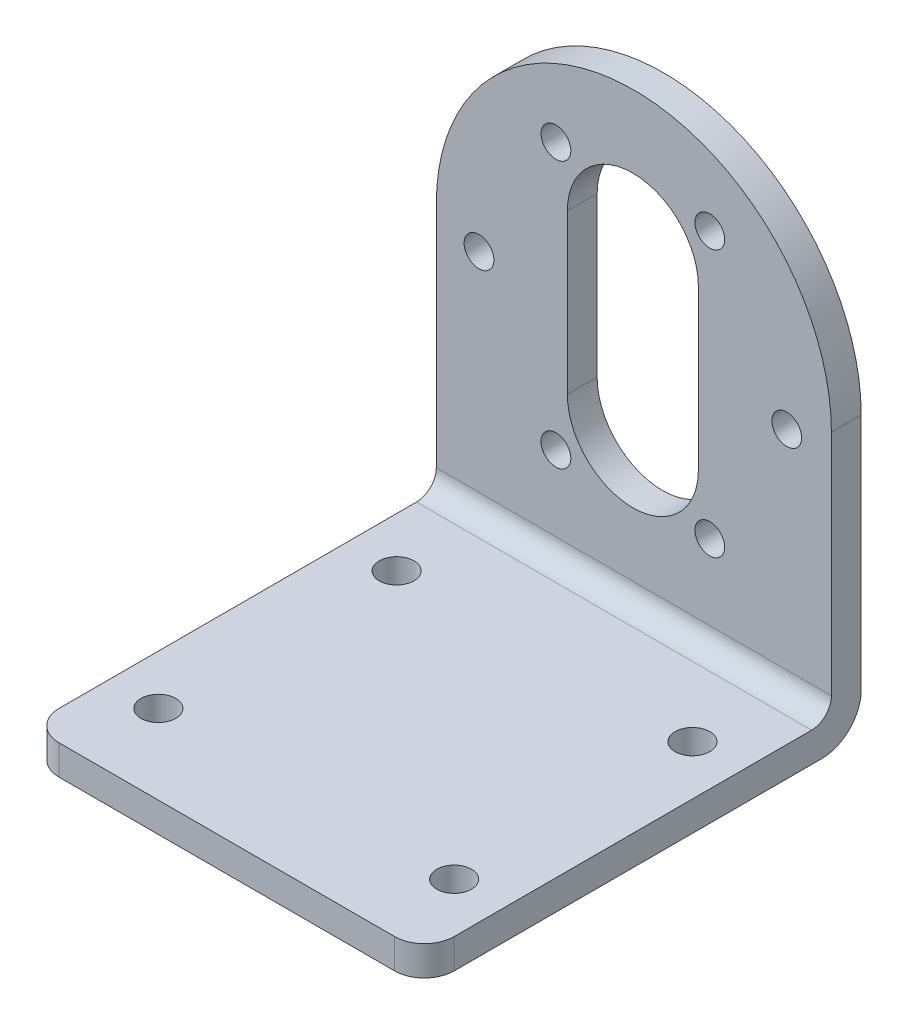
ISO-10303-21;
HEADER;
FILE_DESCRIPTION(('STEP AP214'),'2;1');
FILE_NAME('part.step','',(''),(''),'','','');
FILE_SCHEMA(('AUTOMOTIVE_DESIGN { 1 0 10303 214 1 1 1 1 }'));
ENDSEC;
DATA;
#1=APPLICATION_CONTEXT('core data for automotive mechanical design processes');
#2=APPLICATION_PROTOCOL_DEFINITION('international standard','automotive_design',2000,#1);
#3=PRODUCT_CONTEXT('',#1,'mechanical');
#4=PRODUCT('Part','Part','',(#3));
#5=PRODUCT_RELATED_PRODUCT_CATEGORY('part','',(#4));
#6=PRODUCT_DEFINITION_FORMATION('','',#4);
#7=PRODUCT_DEFINITION_CONTEXT('part definition',#1,'design');
#8=PRODUCT_DEFINITION('design','',#6,#7);
#9=PRODUCT_DEFINITION_SHAPE('','',#8);
#10=(LENGTH_UNIT() NAMED_UNIT(*) SI_UNIT(.MILLI.,.METRE.));
#11=(NAMED_UNIT(*) PLANE_ANGLE_UNIT() SI_UNIT($,.RADIAN.));
#12=(NAMED_UNIT(*) SI_UNIT($,.STERADIAN.) SOLID_ANGLE_UNIT());
#13=UNCERTAINTY_MEASURE_WITH_UNIT(LENGTH_MEASURE(1.E-05),#10,'distance_accuracy_value','');
#14=(GEOMETRIC_REPRESENTATION_CONTEXT(3) GLOBAL_UNCERTAINTY_ASSIGNED_CONTEXT((#13)) GLOBAL_UNIT_ASSIGNED_CONTEXT((#10,
#11,#12)) REPRESENTATION_CONTEXT('',''));
#15=CARTESIAN_POINT('',(0.,0.,0.));
#16=DIRECTION('',(0.,0.,1.));
#17=DIRECTION('',(1.,0.,0.));
#18=AXIS2_PLACEMENT_3D('',#15,#16,#17);
#19=CARTESIAN_POINT('',(-35.5,26.,-41.));
#20=DIRECTION('',(0.,0.,-1.));
#21=DIRECTION('',(-1.,0.,0.));
#22=AXIS2_PLACEMENT_3D('',#19,#20,#21);
#23=CYLINDRICAL_SURFACE('',#22,1.5);
#24=CARTESIAN_POINT('',(-35.5,26.,-44.));
#25=DIRECTION('',(0.,0.,-1.));
#26=DIRECTION('',(-1.,0.,0.));
#27=AXIS2_PLACEMENT_3D('',#24,#25,#26);
#28=CIRCLE('',#27,1.5);
#29=CARTESIAN_POINT('',(-37.,26.,-44.));
#30=VERTEX_POINT('',#29);
#31=EDGE_CURVE('E20',#30,#30,#28,.F.);
#32=ORIENTED_EDGE('',*,*,#31,.F.);
#33=EDGE_LOOP('',(#32));
#34=FACE_BOUND('',#33,.T.);
#35=CARTESIAN_POINT('',(-35.5,26.,-41.));
#36=DIRECTION('',(0.,0.,-1.));
#37=DIRECTION('',(-1.,0.,0.));
#38=AXIS2_PLACEMENT_3D('',#35,#36,#37);
#39=CIRCLE('',#38,1.5);
#40=CARTESIAN_POINT('',(-37.,26.,-41.));
#41=VERTEX_POINT('',#40);
#42=EDGE_CURVE('E286',#41,#41,#39,.F.);
#43=ORIENTED_EDGE('',*,*,#42,.T.);
#44=EDGE_LOOP('',(#43));
#45=FACE_BOUND('',#44,.T.);
#46=ADVANCED_FACE('F17',(#34,#45),#23,.F.);
#47=CARTESIAN_POINT('',(-12.25,39.4233937586588,-41.));
#48=DIRECTION('',(0.,0.,-1.));
#49=DIRECTION('',(-1.,0.,0.));
#50=AXIS2_PLACEMENT_3D('',#47,#48,#49);
#51=CYLINDRICAL_SURFACE('',#50,1.5);
#52=CARTESIAN_POINT('',(-12.25,39.4233937586588,-44.));
#53=DIRECTION('',(0.,0.,-1.));
#54=DIRECTION('',(-1.,0.,0.));
#55=AXIS2_PLACEMENT_3D('',#52,#53,#54);
#56=CIRCLE('',#55,1.5);
#57=CARTESIAN_POINT('',(-13.75,39.4233937586588,-44.));
#58=VERTEX_POINT('',#57);
#59=EDGE_CURVE('E169',#58,#58,#56,.F.);
#60=ORIENTED_EDGE('',*,*,#59,.F.);
#61=EDGE_LOOP('',(#60));
#62=FACE_BOUND('',#61,.T.);
#63=CARTESIAN_POINT('',(-12.25,39.4233937586588,-41.));
#64=DIRECTION('',(0.,0.,-1.));
#65=DIRECTION('',(-1.,0.,0.));
#66=AXIS2_PLACEMENT_3D('',#63,#64,#65);
#67=CIRCLE('',#66,1.5);
#68=CARTESIAN_POINT('',(-13.75,39.4233937586588,-41.));
#69=VERTEX_POINT('',#68);
#70=EDGE_CURVE('E282',#69,#69,#67,.F.);
#71=ORIENTED_EDGE('',*,*,#70,.T.);
#72=EDGE_LOOP('',(#71));
#73=FACE_BOUND('',#72,.T.);
#74=ADVANCED_FACE('F568',(#62,#73),#51,.F.);
#75=CARTESIAN_POINT('',(-27.75,12.5766062413412,-41.));
#76=DIRECTION('',(0.,0.,-1.));
#77=DIRECTION('',(-1.,0.,0.));
#78=AXIS2_PLACEMENT_3D('',#75,#76,#77);
#79=CYLINDRICAL_SURFACE('',#78,1.5);
#80=CARTESIAN_POINT('',(-27.75,12.5766062413412,-44.));
#81=DIRECTION('',(0.,0.,-1.));
#82=DIRECTION('',(-1.,0.,0.));
#83=AXIS2_PLACEMENT_3D('',#80,#81,#82);
#84=CIRCLE('',#83,1.5);
#85=CARTESIAN_POINT('',(-29.25,12.5766062413412,-44.));
#86=VERTEX_POINT('',#85);
#87=EDGE_CURVE('E166',#86,#86,#84,.F.);
#88=ORIENTED_EDGE('',*,*,#87,.F.);
#89=EDGE_LOOP('',(#88));
#90=FACE_BOUND('',#89,.T.);
#91=CARTESIAN_POINT('',(-27.75,12.5766062413412,-41.));
#92=DIRECTION('',(0.,0.,-1.));
#93=DIRECTION('',(-1.,0.,0.));
#94=AXIS2_PLACEMENT_3D('',#91,#92,#93);
#95=CIRCLE('',#94,1.5);
#96=CARTESIAN_POINT('',(-29.25,12.5766062413412,-41.));
#97=VERTEX_POINT('',#96);
#98=EDGE_CURVE('E278',#97,#97,#95,.F.);
#99=ORIENTED_EDGE('',*,*,#98,.T.);
#100=EDGE_LOOP('',(#99));
#101=FACE_BOUND('',#100,.T.);
#102=ADVANCED_FACE('F559',(#90,#101),#79,.F.);
#103=CARTESIAN_POINT('',(-27.75,39.4233937586588,-41.));
#104=DIRECTION('',(0.,0.,-1.));
#105=DIRECTION('',(-1.,0.,0.));
#106=AXIS2_PLACEMENT_3D('',#103,#104,#105);
#107=CYLINDRICAL_SURFACE('',#106,1.5);
#108=CARTESIAN_POINT('',(-27.75,39.4233937586588,-44.));
#109=DIRECTION('',(0.,0.,-1.));
#110=DIRECTION('',(-1.,0.,0.));
#111=AXIS2_PLACEMENT_3D('',#108,#109,#110);
#112=CIRCLE('',#111,1.5);
#113=CARTESIAN_POINT('',(-29.25,39.4233937586588,-44.));
#114=VERTEX_POINT('',#113);
#115=EDGE_CURVE('E162',#114,#114,#112,.F.);
#116=ORIENTED_EDGE('',*,*,#115,.F.);
#117=EDGE_LOOP('',(#116));
#118=FACE_BOUND('',#117,.T.);
#119=CARTESIAN_POINT('',(-27.75,39.4233937586588,-41.));
#120=DIRECTION('',(0.,0.,-1.));
#121=DIRECTION('',(-1.,0.,0.));
#122=AXIS2_PLACEMENT_3D('',#119,#120,#121);
#123=CIRCLE('',#122,1.5);
#124=CARTESIAN_POINT('',(-29.25,39.4233937586588,-41.));
#125=VERTEX_POINT('',#124);
#126=EDGE_CURVE('E274',#125,#125,#123,.F.);
#127=ORIENTED_EDGE('',*,*,#126,.T.);
#128=EDGE_LOOP('',(#127));
#129=FACE_BOUND('',#128,.T.);
#130=ADVANCED_FACE('F550',(#118,#129),#107,.F.);
#131=CARTESIAN_POINT('',(-4.5,26.,-41.));
#132=DIRECTION('',(0.,0.,-1.));
#133=DIRECTION('',(-1.,0.,0.));
#134=AXIS2_PLACEMENT_3D('',#131,#132,#133);
#135=CYLINDRICAL_SURFACE('',#134,1.5);
#136=CARTESIAN_POINT('',(-4.5,26.,-44.));
#137=DIRECTION('',(0.,0.,-1.));
#138=DIRECTION('',(-1.,0.,0.));
#139=AXIS2_PLACEMENT_3D('',#136,#137,#138);
#140=CIRCLE('',#139,1.5);
#141=CARTESIAN_POINT('',(-6.,26.,-44.));
#142=VERTEX_POINT('',#141);
#143=EDGE_CURVE('E154',#142,#142,#140,.F.);
#144=ORIENTED_EDGE('',*,*,#143,.F.);
#145=EDGE_LOOP('',(#144));
#146=FACE_BOUND('',#145,.T.);
#147=CARTESIAN_POINT('',(-4.5,26.,-41.));
#148=DIRECTION('',(0.,0.,-1.));
#149=DIRECTION('',(-1.,0.,0.));
#150=AXIS2_PLACEMENT_3D('',#147,#148,#149);
#151=CIRCLE('',#150,1.5);
#152=CARTESIAN_POINT('',(-6.,26.,-41.));
#153=VERTEX_POINT('',#152);
#154=EDGE_CURVE('E270',#153,#153,#151,.F.);
#155=ORIENTED_EDGE('',*,*,#154,.T.);
#156=EDGE_LOOP('',(#155));
#157=FACE_BOUND('',#156,.T.);
#158=ADVANCED_FACE('F541',(#146,#157),#135,.F.);
#159=CARTESIAN_POINT('',(-12.25,12.5766062413412,-41.));
#160=DIRECTION('',(0.,0.,-1.));
#161=DIRECTION('',(-1.,0.,0.));
#162=AXIS2_PLACEMENT_3D('',#159,#160,#161);
#163=CYLINDRICAL_SURFACE('',#162,1.5);
#164=CARTESIAN_POINT('',(-12.25,12.5766062413412,-44.));
#165=DIRECTION('',(0.,0.,-1.));
#166=DIRECTION('',(-1.,0.,0.));
#167=AXIS2_PLACEMENT_3D('',#164,#165,#166);
#168=CIRCLE('',#167,1.5);
#169=CARTESIAN_POINT('',(-13.75,12.5766062413412,-44.));
#170=VERTEX_POINT('',#169);
#171=EDGE_CURVE('E149',#170,#170,#168,.F.);
#172=ORIENTED_EDGE('',*,*,#171,.F.);
#173=EDGE_LOOP('',(#172));
#174=FACE_BOUND('',#173,.T.);
#175=CARTESIAN_POINT('',(-12.25,12.5766062413412,-41.));
#176=DIRECTION('',(0.,0.,-1.));
#177=DIRECTION('',(-1.,0.,0.));
#178=AXIS2_PLACEMENT_3D('',#175,#176,#177);
#179=CIRCLE('',#178,1.5);
#180=CARTESIAN_POINT('',(-13.75,12.5766062413412,-41.));
#181=VERTEX_POINT('',#180);
#182=EDGE_CURVE('E266',#181,#181,#179,.F.);
#183=ORIENTED_EDGE('',*,*,#182,.T.);
#184=EDGE_LOOP('',(#183));
#185=FACE_BOUND('',#184,.T.);
#186=ADVANCED_FACE('F533',(#174,#185),#163,.F.);
#187=CARTESIAN_POINT('',(-26.6,18.,-41.));
#188=DIRECTION('',(-1.,0.,0.));
#189=DIRECTION('',(0.,-1.,0.));
#190=AXIS2_PLACEMENT_3D('',#187,#188,#189);
#191=PLANE('',#190);
#192=DIRECTION('',(0.,0.,-1.));
#193=VECTOR('',#192,1.);
#194=CARTESIAN_POINT('',(-26.6,34.,-41.));
#195=LINE('',#194,#193);
#196=CARTESIAN_POINT('',(-26.6,34.,-44.));
#197=VERTEX_POINT('',#196);
#198=CARTESIAN_POINT('',(-26.6,34.,-41.));
#199=VERTEX_POINT('',#198);
#200=EDGE_CURVE('E121',#197,#199,#195,.F.);
#201=ORIENTED_EDGE('',*,*,#200,.T.);
#202=DIRECTION('',(0.,1.,0.));
#203=VECTOR('',#202,1.);
#204=CARTESIAN_POINT('',(-26.6,25.45,-41.));
#205=LINE('',#204,#203);
#206=CARTESIAN_POINT('',(-26.6,18.,-41.));
#207=VERTEX_POINT('',#206);
#208=EDGE_CURVE('E265',#199,#207,#205,.F.);
#209=ORIENTED_EDGE('',*,*,#208,.T.);
#210=DIRECTION('',(0.,0.,-1.));
#211=VECTOR('',#210,1.);
#212=CARTESIAN_POINT('',(-26.6,18.,-41.));
#213=LINE('',#212,#211);
#214=CARTESIAN_POINT('',(-26.6,18.,-44.));
#215=VERTEX_POINT('',#214);
#216=EDGE_CURVE('E138',#207,#215,#213,.T.);
#217=ORIENTED_EDGE('',*,*,#216,.T.);
#218=DIRECTION('',(0.,1.,0.));
#219=VECTOR('',#218,1.);
#220=CARTESIAN_POINT('',(-26.6,25.45,-44.));
#221=LINE('',#220,#219);
#222=EDGE_CURVE('E135',#197,#215,#221,.F.);
#223=ORIENTED_EDGE('',*,*,#222,.F.);
#224=EDGE_LOOP('',(#201,#209,#217,#223));
#225=FACE_BOUND('',#224,.T.);
#226=ADVANCED_FACE('F136',(#225),#191,.F.);
#227=CARTESIAN_POINT('',(-20.,18.,-41.));
#228=DIRECTION('',(0.,0.,-1.));
#229=DIRECTION('',(-1.,0.,0.));
#230=AXIS2_PLACEMENT_3D('',#227,#228,#229);
#231=CYLINDRICAL_SURFACE('',#230,6.6);
#232=ORIENTED_EDGE('',*,*,#216,.F.);
#233=CARTESIAN_POINT('',(-20.,18.,-41.));
#234=DIRECTION('',(0.,0.,-1.));
#235=DIRECTION('',(-1.,0.,0.));
#236=AXIS2_PLACEMENT_3D('',#233,#234,#235);
#237=CIRCLE('',#236,6.6);
#238=CARTESIAN_POINT('',(-13.4,18.,-41.));
#239=VERTEX_POINT('',#238);
#240=EDGE_CURVE('E262',#207,#239,#237,.F.);
#241=ORIENTED_EDGE('',*,*,#240,.T.);
#242=DIRECTION('',(0.,0.,1.));
#243=VECTOR('',#242,1.);
#244=CARTESIAN_POINT('',(-13.4,18.,-41.));
#245=LINE('',#244,#243);
#246=CARTESIAN_POINT('',(-13.4,18.,-44.));
#247=VERTEX_POINT('',#246);
#248=EDGE_CURVE('E132',#239,#247,#245,.F.);
#249=ORIENTED_EDGE('',*,*,#248,.T.);
#250=CARTESIAN_POINT('',(-20.,18.,-44.));
#251=DIRECTION('',(0.,0.,-1.));
#252=DIRECTION('',(-1.,0.,0.));
#253=AXIS2_PLACEMENT_3D('',#250,#251,#252);
#254=CIRCLE('',#253,6.6);
#255=EDGE_CURVE('E143',#215,#247,#254,.F.);
#256=ORIENTED_EDGE('',*,*,#255,.F.);
#257=EDGE_LOOP('',(#232,#241,#249,#256));
#258=FACE_BOUND('',#257,.T.);
#259=ADVANCED_FACE('F336',(#258),#231,.F.);
#260=CARTESIAN_POINT('',(-13.4,34.,-41.));
#261=DIRECTION('',(1.,0.,0.));
#262=DIRECTION('',(0.,1.,0.));
#263=AXIS2_PLACEMENT_3D('',#260,#261,#262);
#264=PLANE('',#263);
#265=ORIENTED_EDGE('',*,*,#248,.F.);
#266=DIRECTION('',(0.,1.,0.));
#267=VECTOR('',#266,1.);
#268=CARTESIAN_POINT('',(-13.4,25.45,-41.));
#269=LINE('',#268,#267);
#270=CARTESIAN_POINT('',(-13.4,34.,-41.));
#271=VERTEX_POINT('',#270);
#272=EDGE_CURVE('E261',#239,#271,#269,.T.);
#273=ORIENTED_EDGE('',*,*,#272,.T.);
#274=DIRECTION('',(0.,0.,-1.));
#275=VECTOR('',#274,1.);
#276=CARTESIAN_POINT('',(-13.4,34.,-41.));
#277=LINE('',#276,#275);
#278=CARTESIAN_POINT('',(-13.4,34.,-44.));
#279=VERTEX_POINT('',#278);
#280=EDGE_CURVE('E116',#271,#279,#277,.T.);
#281=ORIENTED_EDGE('',*,*,#280,.T.);
#282=DIRECTION('',(0.,1.,0.));
#283=VECTOR('',#282,1.);
#284=CARTESIAN_POINT('',(-13.4,25.45,-44.));
#285=LINE('',#284,#283);
#286=EDGE_CURVE('E147',#247,#279,#285,.T.);
#287=ORIENTED_EDGE('',*,*,#286,.F.);
#288=EDGE_LOOP('',(#265,#273,#281,#287));
#289=FACE_BOUND('',#288,.T.);
#290=ADVANCED_FACE('F341',(#289),#264,.F.);
#291=CARTESIAN_POINT('',(-20.,34.,-41.));
#292=DIRECTION('',(0.,0.,-1.));
#293=DIRECTION('',(-1.,0.,0.));
#294=AXIS2_PLACEMENT_3D('',#291,#292,#293);
#295=CYLINDRICAL_SURFACE('',#294,6.6);
#296=ORIENTED_EDGE('',*,*,#280,.F.);
#297=CARTESIAN_POINT('',(-20.,34.,-41.));
#298=DIRECTION('',(0.,0.,-1.));
#299=DIRECTION('',(-1.,0.,0.));
#300=AXIS2_PLACEMENT_3D('',#297,#298,#299);
#301=CIRCLE('',#300,6.6);
#302=EDGE_CURVE('E128',#271,#199,#301,.F.);
#303=ORIENTED_EDGE('',*,*,#302,.T.);
#304=ORIENTED_EDGE('',*,*,#200,.F.);
#305=CARTESIAN_POINT('',(-20.,34.,-44.));
#306=DIRECTION('',(0.,0.,-1.));
#307=DIRECTION('',(-1.,0.,0.));
#308=AXIS2_PLACEMENT_3D('',#305,#306,#307);
#309=CIRCLE('',#308,6.6);
#310=EDGE_CURVE('E125',#279,#197,#309,.F.);
#311=ORIENTED_EDGE('',*,*,#310,.F.);
#312=EDGE_LOOP('',(#296,#303,#304,#311));
#313=FACE_BOUND('',#312,.T.);
#314=ADVANCED_FACE('F123',(#313),#295,.F.);
#315=CARTESIAN_POINT('',(-19.9,25.45,-44.));
#316=DIRECTION('',(0.,0.,-1.));
#317=DIRECTION('',(-1.,0.,0.));
#318=AXIS2_PLACEMENT_3D('',#315,#316,#317);
#319=PLANE('',#318);
#320=ORIENTED_EDGE('',*,*,#255,.T.);
#321=ORIENTED_EDGE('',*,*,#286,.T.);
#322=ORIENTED_EDGE('',*,*,#310,.T.);
#323=ORIENTED_EDGE('',*,*,#222,.T.);
#324=EDGE_LOOP('',(#320,#321,#322,#323));
#325=FACE_BOUND('',#324,.T.);
#326=ORIENTED_EDGE('',*,*,#171,.T.);
#327=EDGE_LOOP('',(#326));
#328=FACE_BOUND('',#327,.T.);
#329=ORIENTED_EDGE('',*,*,#143,.T.);
#330=EDGE_LOOP('',(#329));
#331=FACE_BOUND('',#330,.T.);
#332=ORIENTED_EDGE('',*,*,#115,.T.);
#333=EDGE_LOOP('',(#332));
#334=FACE_BOUND('',#333,.T.);
#335=ORIENTED_EDGE('',*,*,#87,.T.);
#336=EDGE_LOOP('',(#335));
#337=FACE_BOUND('',#336,.T.);
#338=ORIENTED_EDGE('',*,*,#59,.T.);
#339=EDGE_LOOP('',(#338));
#340=FACE_BOUND('',#339,.T.);
#341=ORIENTED_EDGE('',*,*,#31,.T.);
#342=EDGE_LOOP('',(#341));
#343=FACE_BOUND('',#342,.T.);
#344=CARTESIAN_POINT('',(-19.9,28.,-44.));
#345=DIRECTION('',(0.,0.,-1.));
#346=DIRECTION('',(-1.,0.,0.));
#347=AXIS2_PLACEMENT_3D('',#344,#345,#346);
#348=CIRCLE('',#347,19.9);
#349=CARTESIAN_POINT('',(0.,28.,-44.));
#350=VERTEX_POINT('',#349);
#351=CARTESIAN_POINT('',(-39.8,28.,-44.));
#352=VERTEX_POINT('',#351);
#353=EDGE_CURVE('E292',#350,#352,#348,.F.);
#354=ORIENTED_EDGE('',*,*,#353,.F.);
#355=DIRECTION('',(0.,1.,0.));
#356=VECTOR('',#355,1.);
#357=CARTESIAN_POINT('',(0.,1.5,-44.));
#358=LINE('',#357,#356);
#359=CARTESIAN_POINT('',(0.,4.,-44.));
#360=VERTEX_POINT('',#359);
#361=EDGE_CURVE('E240',#360,#350,#358,.T.);
#362=ORIENTED_EDGE('',*,*,#361,.F.);
#363=DIRECTION('',(-1.,0.,0.));
#364=VECTOR('',#363,1.);
#365=CARTESIAN_POINT('',(-9.95,4.,-44.));
#366=LINE('',#365,#364);
#367=CARTESIAN_POINT('',(-39.8,4.,-44.));
#368=VERTEX_POINT('',#367);
#369=EDGE_CURVE('E241',#368,#360,#366,.F.);
#370=ORIENTED_EDGE('',*,*,#369,.F.);
#371=DIRECTION('',(0.,1.,0.));
#372=VECTOR('',#371,1.);
#373=CARTESIAN_POINT('',(-39.8,1.5,-44.));
#374=LINE('',#373,#372);
#375=EDGE_CURVE('E246',#352,#368,#374,.F.);
#376=ORIENTED_EDGE('',*,*,#375,.F.);
#377=EDGE_LOOP('',(#354,#362,#370,#376));
#378=FACE_BOUND('',#377,.T.);
#379=ADVANCED_FACE('F145',(#325,#328,#331,#334,#337,#340,#343,#378),#319,.T.);
#380=CARTESIAN_POINT('',(-19.9,28.,-41.));
#381=DIRECTION('',(0.,0.,-1.));
#382=DIRECTION('',(-1.,0.,0.));
#383=AXIS2_PLACEMENT_3D('',#380,#381,#382);
#384=CYLINDRICAL_SURFACE('',#383,19.9);
#385=ORIENTED_EDGE('',*,*,#353,.T.);
#386=DIRECTION('',(0.,0.,1.));
#387=VECTOR('',#386,1.);
#388=CARTESIAN_POINT('',(-39.8,28.,-20.5));
#389=LINE('',#388,#387);
#390=CARTESIAN_POINT('',(-39.8,28.,-41.));
#391=VERTEX_POINT('',#390);
#392=EDGE_CURVE('E306',#391,#352,#389,.F.);
#393=ORIENTED_EDGE('',*,*,#392,.F.);
#394=CARTESIAN_POINT('',(-19.9,28.,-41.));
#395=DIRECTION('',(0.,0.,-1.));
#396=DIRECTION('',(-1.,0.,0.));
#397=AXIS2_PLACEMENT_3D('',#394,#395,#396);
#398=CIRCLE('',#397,19.9);
#399=CARTESIAN_POINT('',(0.,28.,-41.));
#400=VERTEX_POINT('',#399);
#401=EDGE_CURVE('E290',#391,#400,#398,.T.);
#402=ORIENTED_EDGE('',*,*,#401,.T.);
#403=DIRECTION('',(0.,0.,-1.));
#404=VECTOR('',#403,1.);
#405=CARTESIAN_POINT('',(0.,28.,-20.5));
#406=LINE('',#405,#404);
#407=EDGE_CURVE('E302',#350,#400,#406,.F.);
#408=ORIENTED_EDGE('',*,*,#407,.F.);
#409=EDGE_LOOP('',(#385,#393,#402,#408));
#410=FACE_BOUND('',#409,.T.);
#411=ADVANCED_FACE('F407',(#410),#384,.T.);
#412=CARTESIAN_POINT('',(-19.9,25.45,-41.));
#413=DIRECTION('',(0.,0.,-1.));
#414=DIRECTION('',(-1.,0.,0.));
#415=AXIS2_PLACEMENT_3D('',#412,#413,#414);
#416=PLANE('',#415);
#417=ORIENTED_EDGE('',*,*,#272,.F.);
#418=ORIENTED_EDGE('',*,*,#240,.F.);
#419=ORIENTED_EDGE('',*,*,#208,.F.);
#420=ORIENTED_EDGE('',*,*,#302,.F.);
#421=EDGE_LOOP('',(#417,#418,#419,#420));
#422=FACE_BOUND('',#421,.T.);
#423=ORIENTED_EDGE('',*,*,#182,.F.);
#424=EDGE_LOOP('',(#423));
#425=FACE_BOUND('',#424,.T.);
#426=ORIENTED_EDGE('',*,*,#154,.F.);
#427=EDGE_LOOP('',(#426));
#428=FACE_BOUND('',#427,.T.);
#429=ORIENTED_EDGE('',*,*,#126,.F.);
#430=EDGE_LOOP('',(#429));
#431=FACE_BOUND('',#430,.T.);
#432=ORIENTED_EDGE('',*,*,#98,.F.);
#433=EDGE_LOOP('',(#432));
#434=FACE_BOUND('',#433,.T.);
#435=ORIENTED_EDGE('',*,*,#70,.F.);
#436=EDGE_LOOP('',(#435));
#437=FACE_BOUND('',#436,.T.);
#438=ORIENTED_EDGE('',*,*,#42,.F.);
#439=EDGE_LOOP('',(#438));
#440=FACE_BOUND('',#439,.T.);
#441=DIRECTION('',(0.,1.,0.));
#442=VECTOR('',#441,1.);
#443=CARTESIAN_POINT('',(0.,1.5,-41.));
#444=LINE('',#443,#442);
#445=CARTESIAN_POINT('',(0.,5.,-41.));
#446=VERTEX_POINT('',#445);
#447=EDGE_CURVE('E235',#400,#446,#444,.F.);
#448=ORIENTED_EDGE('',*,*,#447,.F.);
#449=ORIENTED_EDGE('',*,*,#401,.F.);
#450=DIRECTION('',(0.,1.,0.));
#451=VECTOR('',#450,1.);
#452=CARTESIAN_POINT('',(-39.8,1.5,-41.));
#453=LINE('',#452,#451);
#454=CARTESIAN_POINT('',(-39.8,5.,-41.));
#455=VERTEX_POINT('',#454);
#456=EDGE_CURVE('E251',#455,#391,#453,.T.);
#457=ORIENTED_EDGE('',*,*,#456,.F.);
#458=DIRECTION('',(-1.,0.,0.));
#459=VECTOR('',#458,1.);
#460=CARTESIAN_POINT('',(-9.95,5.,-41.));
#461=LINE('',#460,#459);
#462=EDGE_CURVE('E260',#455,#446,#461,.F.);
#463=ORIENTED_EDGE('',*,*,#462,.T.);
#464=EDGE_LOOP('',(#448,#449,#457,#463));
#465=FACE_BOUND('',#464,.T.);
#466=ADVANCED_FACE('F339',(#422,#425,#428,#431,#434,#437,#440,#465),#416,.F.);
#467=CARTESIAN_POINT('',(-9.95,5.,-39.));
#468=DIRECTION('',(-1.,0.,0.));
#469=DIRECTION('',(0.,0.,1.));
#470=AXIS2_PLACEMENT_3D('',#467,#468,#469);
#471=CYLINDRICAL_SURFACE('',#470,2.);
#472=ORIENTED_EDGE('',*,*,#462,.F.);
#473=CARTESIAN_POINT('',(-39.8,5.,-39.));
#474=DIRECTION('',(-1.,0.,0.));
#475=DIRECTION('',(0.,0.,1.));
#476=AXIS2_PLACEMENT_3D('',#473,#474,#475);
#477=CIRCLE('',#476,2.);
#478=CARTESIAN_POINT('',(-39.8,3.,-39.));
#479=VERTEX_POINT('',#478);
#480=EDGE_CURVE('E247',#479,#455,#477,.F.);
#481=ORIENTED_EDGE('',*,*,#480,.F.);
#482=DIRECTION('',(1.,0.,0.));
#483=VECTOR('',#482,1.);
#484=CARTESIAN_POINT('',(0.,3.,-39.));
#485=LINE('',#484,#483);
#486=CARTESIAN_POINT('',(0.,3.,-39.));
#487=VERTEX_POINT('',#486);
#488=EDGE_CURVE('E257',#487,#479,#485,.F.);
#489=ORIENTED_EDGE('',*,*,#488,.F.);
#490=CARTESIAN_POINT('',(0.,5.,-39.));
#491=DIRECTION('',(-1.,0.,0.));
#492=DIRECTION('',(0.,0.,1.));
#493=AXIS2_PLACEMENT_3D('',#490,#491,#492);
#494=CIRCLE('',#493,2.);
#495=EDGE_CURVE('E230',#446,#487,#494,.T.);
#496=ORIENTED_EDGE('',*,*,#495,.F.);
#497=EDGE_LOOP('',(#472,#481,#489,#496));
#498=FACE_BOUND('',#497,.T.);
#499=ADVANCED_FACE('F400',(#498),#471,.F.);
#500=CARTESIAN_POINT('',(0.,3.,0.));
#501=DIRECTION('',(0.,1.,0.));
#502=DIRECTION('',(0.,0.,1.));
#503=AXIS2_PLACEMENT_3D('',#500,#501,#502);
#504=PLANE('',#503);
#505=CARTESIAN_POINT('',(-34.8,3.,-8.));
#506=DIRECTION('',(0.,-1.,0.));
#507=DIRECTION('',(0.,0.,-1.));
#508=AXIS2_PLACEMENT_3D('',#505,#506,#507);
#509=CIRCLE('',#508,1.75);
#510=CARTESIAN_POINT('',(-34.8,3.,-9.75));
#511=VERTEX_POINT('',#510);
#512=EDGE_CURVE('E220',#511,#511,#509,.T.);
#513=ORIENTED_EDGE('',*,*,#512,.T.);
#514=EDGE_LOOP('',(#513));
#515=FACE_BOUND('',#514,.T.);
#516=CARTESIAN_POINT('',(-5.,3.,-8.));
#517=DIRECTION('',(0.,-1.,0.));
#518=DIRECTION('',(0.,0.,-1.));
#519=AXIS2_PLACEMENT_3D('',#516,#517,#518);
#520=CIRCLE('',#519,1.75);
#521=CARTESIAN_POINT('',(-5.,3.,-9.75));
#522=VERTEX_POINT('',#521);
#523=EDGE_CURVE('E216',#522,#522,#520,.T.);
#524=ORIENTED_EDGE('',*,*,#523,.T.);
#525=EDGE_LOOP('',(#524));
#526=FACE_BOUND('',#525,.T.);
#527=CARTESIAN_POINT('',(-34.8,3.,-32.));
#528=DIRECTION('',(0.,-1.,0.));
#529=DIRECTION('',(0.,0.,-1.));
#530=AXIS2_PLACEMENT_3D('',#527,#528,#529);
#531=CIRCLE('',#530,1.75);
#532=CARTESIAN_POINT('',(-34.8,3.,-33.75));
#533=VERTEX_POINT('',#532);
#534=EDGE_CURVE('E212',#533,#533,#531,.T.);
#535=ORIENTED_EDGE('',*,*,#534,.T.);
#536=EDGE_LOOP('',(#535));
#537=FACE_BOUND('',#536,.T.);
#538=CARTESIAN_POINT('',(-5.,3.,-32.));
#539=DIRECTION('',(0.,-1.,0.));
#540=DIRECTION('',(0.,0.,-1.));
#541=AXIS2_PLACEMENT_3D('',#538,#539,#540);
#542=CIRCLE('',#541,1.75);
#543=CARTESIAN_POINT('',(-5.,3.,-33.75));
#544=VERTEX_POINT('',#543);
#545=EDGE_CURVE('E208',#544,#544,#542,.T.);
#546=ORIENTED_EDGE('',*,*,#545,.T.);
#547=EDGE_LOOP('',(#546));
#548=FACE_BOUND('',#547,.T.);
#549=ORIENTED_EDGE('',*,*,#488,.T.);
#550=DIRECTION('',(0.,0.,1.));
#551=VECTOR('',#550,1.);
#552=CARTESIAN_POINT('',(-39.8,3.,-20.5));
#553=LINE('',#552,#551);
#554=CARTESIAN_POINT('',(-39.8,3.,-3.));
#555=VERTEX_POINT('',#554);
#556=EDGE_CURVE('E252',#555,#479,#553,.F.);
#557=ORIENTED_EDGE('',*,*,#556,.F.);
#558=CARTESIAN_POINT('',(-36.8,3.,-3.));
#559=DIRECTION('',(0.,1.,0.));
#560=DIRECTION('',(0.,0.,1.));
#561=AXIS2_PLACEMENT_3D('',#558,#559,#560);
#562=CIRCLE('',#561,3.);
#563=CARTESIAN_POINT('',(-36.8,3.,0.));
#564=VERTEX_POINT('',#563);
#565=EDGE_CURVE('E253',#564,#555,#562,.F.);
#566=ORIENTED_EDGE('',*,*,#565,.F.);
#567=DIRECTION('',(1.,0.,0.));
#568=VECTOR('',#567,1.);
#569=CARTESIAN_POINT('',(0.,3.,0.));
#570=LINE('',#569,#568);
#571=CARTESIAN_POINT('',(-3.,3.,0.));
#572=VERTEX_POINT('',#571);
#573=EDGE_CURVE('E224',#572,#564,#570,.F.);
#574=ORIENTED_EDGE('',*,*,#573,.F.);
#575=CARTESIAN_POINT('',(-3.,3.,-3.));
#576=DIRECTION('',(0.,-1.,0.));
#577=DIRECTION('',(0.,0.,-1.));
#578=AXIS2_PLACEMENT_3D('',#575,#576,#577);
#579=CIRCLE('',#578,3.);
#580=CARTESIAN_POINT('',(0.,3.,-3.));
#581=VERTEX_POINT('',#580);
#582=EDGE_CURVE('E225',#581,#572,#579,.T.);
#583=ORIENTED_EDGE('',*,*,#582,.F.);
#584=DIRECTION('',(0.,0.,-1.));
#585=VECTOR('',#584,1.);
#586=CARTESIAN_POINT('',(0.,3.,-20.5));
#587=LINE('',#586,#585);
#588=EDGE_CURVE('E234',#487,#581,#587,.F.);
#589=ORIENTED_EDGE('',*,*,#588,.F.);
#590=EDGE_LOOP('',(#549,#557,#566,#574,#583,#589));
#591=FACE_BOUND('',#590,.T.);
#592=ADVANCED_FACE('F396',(#515,#526,#537,#548,#591),#504,.T.);
#593=CARTESIAN_POINT('',(-36.8,0.75,-3.));
#594=DIRECTION('',(0.,1.,0.));
#595=DIRECTION('',(0.,0.,1.));
#596=AXIS2_PLACEMENT_3D('',#593,#594,#595);
#597=CYLINDRICAL_SURFACE('',#596,3.);
#598=CARTESIAN_POINT('',(-36.8,0.,-3.));
#599=DIRECTION('',(0.,1.,0.));
#600=DIRECTION('',(0.,0.,1.));
#601=AXIS2_PLACEMENT_3D('',#598,#599,#600);
#602=CIRCLE('',#601,3.);
#603=CARTESIAN_POINT('',(-36.8,0.,0.));
#604=VERTEX_POINT('',#603);
#605=CARTESIAN_POINT('',(-39.8,0.,-3.));
#606=VERTEX_POINT('',#605);
#607=EDGE_CURVE('E203',#604,#606,#602,.F.);
#608=ORIENTED_EDGE('',*,*,#607,.F.);
#609=DIRECTION('',(0.,1.,0.));
#610=VECTOR('',#609,1.);
#611=CARTESIAN_POINT('',(-36.8,0.,0.));
#612=LINE('',#611,#610);
#613=EDGE_CURVE('E228',#564,#604,#612,.F.);
#614=ORIENTED_EDGE('',*,*,#613,.F.);
#615=ORIENTED_EDGE('',*,*,#565,.T.);
#616=DIRECTION('',(0.,1.,0.));
#617=VECTOR('',#616,1.);
#618=CARTESIAN_POINT('',(-39.8,1.5,-3.));
#619=LINE('',#618,#617);
#620=EDGE_CURVE('E256',#606,#555,#619,.T.);
#621=ORIENTED_EDGE('',*,*,#620,.F.);
#622=EDGE_LOOP('',(#608,#614,#615,#621));
#623=FACE_BOUND('',#622,.T.);
#624=ADVANCED_FACE('F393',(#623),#597,.T.);
#625=CARTESIAN_POINT('',(-39.8,1.5,-20.5));
#626=DIRECTION('',(-1.,0.,0.));
#627=DIRECTION('',(0.,0.,1.));
#628=AXIS2_PLACEMENT_3D('',#625,#626,#627);
#629=PLANE('',#628);
#630=CARTESIAN_POINT('',(-39.8,4.,-40.));
#631=DIRECTION('',(-1.,0.,0.));
#632=DIRECTION('',(0.,0.,1.));
#633=AXIS2_PLACEMENT_3D('',#630,#631,#632);
#634=CIRCLE('',#633,4.);
#635=CARTESIAN_POINT('',(-39.8,0.,-40.));
#636=VERTEX_POINT('',#635);
#637=EDGE_CURVE('E242',#636,#368,#634,.F.);
#638=ORIENTED_EDGE('',*,*,#637,.F.);
#639=DIRECTION('',(0.,0.,-1.));
#640=VECTOR('',#639,1.);
#641=CARTESIAN_POINT('',(-39.8,0.,-41.));
#642=LINE('',#641,#640);
#643=EDGE_CURVE('E207',#606,#636,#642,.T.);
#644=ORIENTED_EDGE('',*,*,#643,.F.);
#645=ORIENTED_EDGE('',*,*,#620,.T.);
#646=ORIENTED_EDGE('',*,*,#556,.T.);
#647=ORIENTED_EDGE('',*,*,#480,.T.);
#648=ORIENTED_EDGE('',*,*,#456,.T.);
#649=ORIENTED_EDGE('',*,*,#392,.T.);
#650=ORIENTED_EDGE('',*,*,#375,.T.);
#651=EDGE_LOOP('',(#638,#644,#645,#646,#647,#648,#649,#650));
#652=FACE_BOUND('',#651,.T.);
#653=ADVANCED_FACE('F389',(#652),#629,.T.);
#654=CARTESIAN_POINT('',(-9.95,4.,-40.));
#655=DIRECTION('',(-1.,0.,0.));
#656=DIRECTION('',(0.,0.,1.));
#657=AXIS2_PLACEMENT_3D('',#654,#655,#656);
#658=CYLINDRICAL_SURFACE('',#657,4.);
#659=CARTESIAN_POINT('',(0.,4.,-40.));
#660=DIRECTION('',(-1.,0.,0.));
#661=DIRECTION('',(0.,0.,1.));
#662=AXIS2_PLACEMENT_3D('',#659,#660,#661);
#663=CIRCLE('',#662,4.);
#664=CARTESIAN_POINT('',(0.,0.,-40.));
#665=VERTEX_POINT('',#664);
#666=EDGE_CURVE('E236',#665,#360,#663,.F.);
#667=ORIENTED_EDGE('',*,*,#666,.F.);
#668=DIRECTION('',(1.,0.,0.));
#669=VECTOR('',#668,1.);
#670=CARTESIAN_POINT('',(0.,0.,-40.));
#671=LINE('',#670,#669);
#672=EDGE_CURVE('E609',#636,#665,#671,.T.);
#673=ORIENTED_EDGE('',*,*,#672,.F.);
#674=ORIENTED_EDGE('',*,*,#637,.T.);
#675=ORIENTED_EDGE('',*,*,#369,.T.);
#676=EDGE_LOOP('',(#667,#673,#674,#675));
#677=FACE_BOUND('',#676,.T.);
#678=ADVANCED_FACE('F385',(#677),#658,.T.);
#679=CARTESIAN_POINT('',(0.,1.5,-20.5));
#680=DIRECTION('',(1.,0.,0.));
#681=DIRECTION('',(0.,0.,-1.));
#682=AXIS2_PLACEMENT_3D('',#679,#680,#681);
#683=PLANE('',#682);
#684=ORIENTED_EDGE('',*,*,#495,.T.);
#685=ORIENTED_EDGE('',*,*,#588,.T.);
#686=DIRECTION('',(0.,-1.,0.));
#687=VECTOR('',#686,1.);
#688=CARTESIAN_POINT('',(0.,0.75,-3.));
#689=LINE('',#688,#687);
#690=CARTESIAN_POINT('',(0.,0.,-3.));
#691=VERTEX_POINT('',#690);
#692=EDGE_CURVE('E229',#691,#581,#689,.F.);
#693=ORIENTED_EDGE('',*,*,#692,.F.);
#694=DIRECTION('',(0.,0.,-1.));
#695=VECTOR('',#694,1.);
#696=CARTESIAN_POINT('',(0.,0.,-41.));
#697=LINE('',#696,#695);
#698=EDGE_CURVE('E202',#665,#691,#697,.F.);
#699=ORIENTED_EDGE('',*,*,#698,.F.);
#700=ORIENTED_EDGE('',*,*,#666,.T.);
#701=ORIENTED_EDGE('',*,*,#361,.T.);
#702=ORIENTED_EDGE('',*,*,#407,.T.);
#703=ORIENTED_EDGE('',*,*,#447,.T.);
#704=EDGE_LOOP('',(#684,#685,#693,#699,#700,#701,#702,#703));
#705=FACE_BOUND('',#704,.T.);
#706=ADVANCED_FACE('F382',(#705),#683,.T.);
#707=CARTESIAN_POINT('',(-3.,0.75,-3.));
#708=DIRECTION('',(0.,-1.,0.));
#709=DIRECTION('',(0.,0.,-1.));
#710=AXIS2_PLACEMENT_3D('',#707,#708,#709);
#711=CYLINDRICAL_SURFACE('',#710,3.);
#712=ORIENTED_EDGE('',*,*,#582,.T.);
#713=DIRECTION('',(0.,1.,0.));
#714=VECTOR('',#713,1.);
#715=CARTESIAN_POINT('',(-3.,0.,0.));
#716=LINE('',#715,#714);
#717=CARTESIAN_POINT('',(-3.,0.,0.));
#718=VERTEX_POINT('',#717);
#719=EDGE_CURVE('E36',#718,#572,#716,.T.);
#720=ORIENTED_EDGE('',*,*,#719,.F.);
#721=CARTESIAN_POINT('',(-3.,0.,-3.));
#722=DIRECTION('',(0.,-1.,0.));
#723=DIRECTION('',(0.,0.,-1.));
#724=AXIS2_PLACEMENT_3D('',#721,#722,#723);
#725=CIRCLE('',#724,3.);
#726=EDGE_CURVE('E198',#691,#718,#725,.T.);
#727=ORIENTED_EDGE('',*,*,#726,.F.);
#728=ORIENTED_EDGE('',*,*,#692,.T.);
#729=EDGE_LOOP('',(#712,#720,#727,#728));
#730=FACE_BOUND('',#729,.T.);
#731=ADVANCED_FACE('F378',(#730),#711,.T.);
#732=CARTESIAN_POINT('',(0.,0.,0.));
#733=DIRECTION('',(0.,0.,1.));
#734=DIRECTION('',(1.,0.,0.));
#735=AXIS2_PLACEMENT_3D('',#732,#733,#734);
#736=PLANE('',#735);
#737=ORIENTED_EDGE('',*,*,#719,.T.);
#738=ORIENTED_EDGE('',*,*,#573,.T.);
#739=ORIENTED_EDGE('',*,*,#613,.T.);
#740=DIRECTION('',(1.,0.,0.));
#741=VECTOR('',#740,1.);
#742=CARTESIAN_POINT('',(0.,0.,0.));
#743=LINE('',#742,#741);
#744=EDGE_CURVE('E197',#718,#604,#743,.F.);
#745=ORIENTED_EDGE('',*,*,#744,.F.);
#746=EDGE_LOOP('',(#737,#738,#739,#745));
#747=FACE_BOUND('',#746,.T.);
#748=ADVANCED_FACE('F374',(#747),#736,.T.);
#749=CARTESIAN_POINT('',(-34.8,3.,-8.));
#750=DIRECTION('',(0.,-1.,0.));
#751=DIRECTION('',(0.,0.,-1.));
#752=AXIS2_PLACEMENT_3D('',#749,#750,#751);
#753=CYLINDRICAL_SURFACE('',#752,1.75);
#754=CARTESIAN_POINT('',(-34.8,0.,-8.));
#755=DIRECTION('',(0.,-1.,0.));
#756=DIRECTION('',(0.,0.,-1.));
#757=AXIS2_PLACEMENT_3D('',#754,#755,#756);
#758=CIRCLE('',#757,1.75);
#759=CARTESIAN_POINT('',(-34.8,0.,-9.75));
#760=VERTEX_POINT('',#759);
#761=EDGE_CURVE('E193',#760,#760,#758,.F.);
#762=ORIENTED_EDGE('',*,*,#761,.F.);
#763=EDGE_LOOP('',(#762));
#764=FACE_BOUND('',#763,.T.);
#765=ORIENTED_EDGE('',*,*,#512,.F.);
#766=EDGE_LOOP('',(#765));
#767=FACE_BOUND('',#766,.T.);
#768=ADVANCED_FACE('F370',(#764,#767),#753,.F.);
#769=CARTESIAN_POINT('',(-5.,3.,-8.));
#770=DIRECTION('',(0.,-1.,0.));
#771=DIRECTION('',(0.,0.,-1.));
#772=AXIS2_PLACEMENT_3D('',#769,#770,#771);
#773=CYLINDRICAL_SURFACE('',#772,1.75);
#774=CARTESIAN_POINT('',(-5.,0.,-8.));
#775=DIRECTION('',(0.,-1.,0.));
#776=DIRECTION('',(0.,0.,-1.));
#777=AXIS2_PLACEMENT_3D('',#774,#775,#776);
#778=CIRCLE('',#777,1.75);
#779=CARTESIAN_POINT('',(-5.,0.,-9.75));
#780=VERTEX_POINT('',#779);
#781=EDGE_CURVE('E189',#780,#780,#778,.F.);
#782=ORIENTED_EDGE('',*,*,#781,.F.);
#783=EDGE_LOOP('',(#782));
#784=FACE_BOUND('',#783,.T.);
#785=ORIENTED_EDGE('',*,*,#523,.F.);
#786=EDGE_LOOP('',(#785));
#787=FACE_BOUND('',#786,.T.);
#788=ADVANCED_FACE('F366',(#784,#787),#773,.F.);
#789=CARTESIAN_POINT('',(-34.8,3.,-32.));
#790=DIRECTION('',(0.,-1.,0.));
#791=DIRECTION('',(0.,0.,-1.));
#792=AXIS2_PLACEMENT_3D('',#789,#790,#791);
#793=CYLINDRICAL_SURFACE('',#792,1.75);
#794=CARTESIAN_POINT('',(-34.8,0.,-32.));
#795=DIRECTION('',(0.,-1.,0.));
#796=DIRECTION('',(0.,0.,-1.));
#797=AXIS2_PLACEMENT_3D('',#794,#795,#796);
#798=CIRCLE('',#797,1.75);
#799=CARTESIAN_POINT('',(-34.8,0.,-33.75));
#800=VERTEX_POINT('',#799);
#801=EDGE_CURVE('E27',#800,#800,#798,.F.);
#802=ORIENTED_EDGE('',*,*,#801,.F.);
#803=EDGE_LOOP('',(#802));
#804=FACE_BOUND('',#803,.T.);
#805=ORIENTED_EDGE('',*,*,#534,.F.);
#806=EDGE_LOOP('',(#805));
#807=FACE_BOUND('',#806,.T.);
#808=ADVANCED_FACE('F359',(#804,#807),#793,.F.);
#809=CARTESIAN_POINT('',(-5.,3.,-32.));
#810=DIRECTION('',(0.,-1.,0.));
#811=DIRECTION('',(0.,0.,-1.));
#812=AXIS2_PLACEMENT_3D('',#809,#810,#811);
#813=CYLINDRICAL_SURFACE('',#812,1.75);
#814=CARTESIAN_POINT('',(-5.,0.,-32.));
#815=DIRECTION('',(0.,-1.,0.));
#816=DIRECTION('',(0.,0.,-1.));
#817=AXIS2_PLACEMENT_3D('',#814,#815,#816);
#818=CIRCLE('',#817,1.75);
#819=CARTESIAN_POINT('',(-5.,0.,-33.75));
#820=VERTEX_POINT('',#819);
#821=EDGE_CURVE('E11',#820,#820,#818,.F.);
#822=ORIENTED_EDGE('',*,*,#821,.F.);
#823=EDGE_LOOP('',(#822));
#824=FACE_BOUND('',#823,.T.);
#825=ORIENTED_EDGE('',*,*,#545,.F.);
#826=EDGE_LOOP('',(#825));
#827=FACE_BOUND('',#826,.T.);
#828=ADVANCED_FACE('F353',(#824,#827),#813,.F.);
#829=CARTESIAN_POINT('',(0.,0.,-41.));
#830=DIRECTION('',(0.,-1.,0.));
#831=DIRECTION('',(0.,0.,-1.));
#832=AXIS2_PLACEMENT_3D('',#829,#830,#831);
#833=PLANE('',#832);
#834=ORIENTED_EDGE('',*,*,#821,.T.);
#835=EDGE_LOOP('',(#834));
#836=FACE_BOUND('',#835,.T.);
#837=ORIENTED_EDGE('',*,*,#801,.T.);
#838=EDGE_LOOP('',(#837));
#839=FACE_BOUND('',#838,.T.);
#840=ORIENTED_EDGE('',*,*,#781,.T.);
#841=EDGE_LOOP('',(#840));
#842=FACE_BOUND('',#841,.T.);
#843=ORIENTED_EDGE('',*,*,#761,.T.);
#844=EDGE_LOOP('',(#843));
#845=FACE_BOUND('',#844,.T.);
#846=ORIENTED_EDGE('',*,*,#726,.T.);
#847=ORIENTED_EDGE('',*,*,#744,.T.);
#848=ORIENTED_EDGE('',*,*,#607,.T.);
#849=ORIENTED_EDGE('',*,*,#643,.T.);
#850=ORIENTED_EDGE('',*,*,#672,.T.);
#851=ORIENTED_EDGE('',*,*,#698,.T.);
#852=EDGE_LOOP('',(#846,#847,#848,#849,#850,#851));
#853=FACE_BOUND('',#852,.T.);
#854=ADVANCED_FACE('F351',(#836,#839,#842,#845,#853),#833,.T.);
#855=CLOSED_SHELL('',(#46,#74,#102,#130,#158,#186,#226,#259,#290,#314,#379,#411,#466,#499,#592,
#624,#653,#678,#706,#731,#748,#768,#788,#808,#828,#854));
#856=MANIFOLD_SOLID_BREP('B1',#855);
#857=ADVANCED_BREP_SHAPE_REPRESENTATION('',(#18,#856),#14);
#858=SHAPE_DEFINITION_REPRESENTATION(#9,#857);
ENDSEC;
END-ISO-10303-21;
